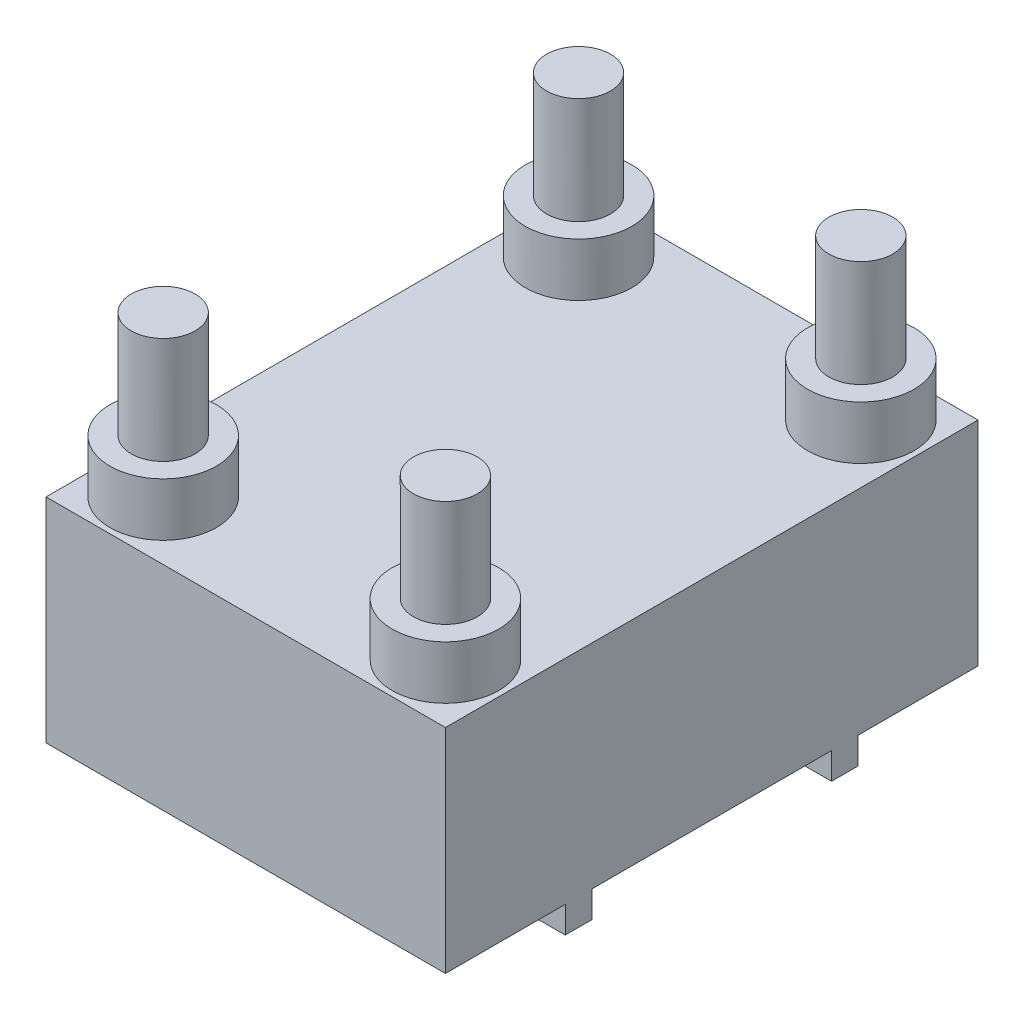
ISO-10303-21;
HEADER;
FILE_DESCRIPTION(('STEP AP214'),'2;1');
FILE_NAME('part.step','',(''),(''),'','','');
FILE_SCHEMA(('AUTOMOTIVE_DESIGN { 1 0 10303 214 1 1 1 1 }'));
ENDSEC;
DATA;
#1=APPLICATION_CONTEXT('core data for automotive mechanical design processes');
#2=APPLICATION_PROTOCOL_DEFINITION('international standard','automotive_design',2000,#1);
#3=PRODUCT_CONTEXT('',#1,'mechanical');
#4=PRODUCT('Part','Part','',(#3));
#5=PRODUCT_RELATED_PRODUCT_CATEGORY('part','',(#4));
#6=PRODUCT_DEFINITION_FORMATION('','',#4);
#7=PRODUCT_DEFINITION_CONTEXT('part definition',#1,'design');
#8=PRODUCT_DEFINITION('design','',#6,#7);
#9=PRODUCT_DEFINITION_SHAPE('','',#8);
#10=(LENGTH_UNIT() NAMED_UNIT(*) SI_UNIT(.MILLI.,.METRE.));
#11=(NAMED_UNIT(*) PLANE_ANGLE_UNIT() SI_UNIT($,.RADIAN.));
#12=(NAMED_UNIT(*) SI_UNIT($,.STERADIAN.) SOLID_ANGLE_UNIT());
#13=UNCERTAINTY_MEASURE_WITH_UNIT(LENGTH_MEASURE(1.E-05),#10,'distance_accuracy_value','');
#14=(GEOMETRIC_REPRESENTATION_CONTEXT(3) GLOBAL_UNCERTAINTY_ASSIGNED_CONTEXT((#13)) GLOBAL_UNIT_ASSIGNED_CONTEXT((#10,
#11,#12)) REPRESENTATION_CONTEXT('',''));
#15=CARTESIAN_POINT('',(0.,0.,0.));
#16=DIRECTION('',(0.,0.,1.));
#17=DIRECTION('',(1.,0.,0.));
#18=AXIS2_PLACEMENT_3D('',#15,#16,#17);
#19=CARTESIAN_POINT('',(0.,0.,0.));
#20=DIRECTION('',(0.,-1.,0.));
#21=DIRECTION('',(0.,0.,-1.));
#22=AXIS2_PLACEMENT_3D('',#19,#20,#21);
#23=PLANE('',#22);
#24=DIRECTION('',(0.,0.,1.));
#25=VECTOR('',#24,1.);
#26=CARTESIAN_POINT('',(-37.5,0.,-50.));
#27=LINE('',#26,#25);
#28=CARTESIAN_POINT('',(-37.5,0.,-22.5));
#29=VERTEX_POINT('',#28);
#30=CARTESIAN_POINT('',(-37.5,0.,22.5));
#31=VERTEX_POINT('',#30);
#32=EDGE_CURVE('E144',#29,#31,#27,.T.);
#33=ORIENTED_EDGE('',*,*,#32,.F.);
#34=DIRECTION('',(-1.,0.,0.));
#35=VECTOR('',#34,1.);
#36=CARTESIAN_POINT('',(37.5,0.,-22.5));
#37=LINE('',#36,#35);
#38=CARTESIAN_POINT('',(37.5,0.,-22.5));
#39=VERTEX_POINT('',#38);
#40=EDGE_CURVE('E133',#39,#29,#37,.T.);
#41=ORIENTED_EDGE('',*,*,#40,.F.);
#42=DIRECTION('',(0.,0.,-1.));
#43=VECTOR('',#42,1.);
#44=CARTESIAN_POINT('',(37.5,0.,-50.));
#45=LINE('',#44,#43);
#46=CARTESIAN_POINT('',(37.5,0.,22.5));
#47=VERTEX_POINT('',#46);
#48=EDGE_CURVE('E63',#47,#39,#45,.T.);
#49=ORIENTED_EDGE('',*,*,#48,.F.);
#50=DIRECTION('',(-1.,0.,0.));
#51=VECTOR('',#50,1.);
#52=CARTESIAN_POINT('',(37.5,0.,22.5));
#53=LINE('',#52,#51);
#54=EDGE_CURVE('E267',#47,#31,#53,.T.);
#55=ORIENTED_EDGE('',*,*,#54,.T.);
#56=EDGE_LOOP('',(#33,#41,#49,#55));
#57=FACE_BOUND('',#56,.T.);
#58=ADVANCED_FACE('F39',(#57),#23,.T.);
#59=DIRECTION('',(-1.,0.,0.));
#60=VECTOR('',#59,1.);
#61=CARTESIAN_POINT('',(37.5,0.,-27.5));
#62=LINE('',#61,#60);
#63=CARTESIAN_POINT('',(37.5,0.,-27.5));
#64=VERTEX_POINT('',#63);
#65=CARTESIAN_POINT('',(-37.5,0.,-27.5));
#66=VERTEX_POINT('',#65);
#67=EDGE_CURVE('E55',#64,#66,#62,.T.);
#68=ORIENTED_EDGE('',*,*,#67,.T.);
#69=CARTESIAN_POINT('',(-37.5,0.,-50.));
#70=VERTEX_POINT('',#69);
#71=EDGE_CURVE('E233',#70,#66,#27,.T.);
#72=ORIENTED_EDGE('',*,*,#71,.F.);
#73=DIRECTION('',(-1.,0.,0.));
#74=VECTOR('',#73,1.);
#75=CARTESIAN_POINT('',(37.5,0.,-50.));
#76=LINE('',#75,#74);
#77=CARTESIAN_POINT('',(37.5,0.,-50.));
#78=VERTEX_POINT('',#77);
#79=EDGE_CURVE('E159',#78,#70,#76,.T.);
#80=ORIENTED_EDGE('',*,*,#79,.F.);
#81=EDGE_CURVE('E155',#64,#78,#45,.T.);
#82=ORIENTED_EDGE('',*,*,#81,.F.);
#83=EDGE_LOOP('',(#68,#72,#80,#82));
#84=FACE_BOUND('',#83,.T.);
#85=ADVANCED_FACE('F310',(#84),#23,.T.);
#86=CARTESIAN_POINT('',(-37.5,40.,-50.));
#87=DIRECTION('',(1.,0.,0.));
#88=DIRECTION('',(0.,0.,-1.));
#89=AXIS2_PLACEMENT_3D('',#86,#87,#88);
#90=PLANE('',#89);
#91=ORIENTED_EDGE('',*,*,#71,.T.);
#92=DIRECTION('',(0.,1.,0.));
#93=VECTOR('',#92,1.);
#94=CARTESIAN_POINT('',(-37.5,-5.,-27.5));
#95=LINE('',#94,#93);
#96=CARTESIAN_POINT('',(-37.5,-5.,-27.5));
#97=VERTEX_POINT('',#96);
#98=EDGE_CURVE('E281',#97,#66,#95,.T.);
#99=ORIENTED_EDGE('',*,*,#98,.F.);
#100=DIRECTION('',(0.,0.,-1.));
#101=VECTOR('',#100,1.);
#102=CARTESIAN_POINT('',(-37.5,-5.,-22.5));
#103=LINE('',#102,#101);
#104=CARTESIAN_POINT('',(-37.5,-5.,-22.5));
#105=VERTEX_POINT('',#104);
#106=EDGE_CURVE('E284',#105,#97,#103,.T.);
#107=ORIENTED_EDGE('',*,*,#106,.F.);
#108=DIRECTION('',(0.,1.,0.));
#109=VECTOR('',#108,1.);
#110=CARTESIAN_POINT('',(-37.5,-5.,-22.5));
#111=LINE('',#110,#109);
#112=EDGE_CURVE('E140',#105,#29,#111,.T.);
#113=ORIENTED_EDGE('',*,*,#112,.T.);
#114=ORIENTED_EDGE('',*,*,#32,.T.);
#115=DIRECTION('',(0.,1.,0.));
#116=VECTOR('',#115,1.);
#117=CARTESIAN_POINT('',(-37.5,-5.,22.5));
#118=LINE('',#117,#116);
#119=CARTESIAN_POINT('',(-37.5,-5.,22.5));
#120=VERTEX_POINT('',#119);
#121=EDGE_CURVE('E252',#120,#31,#118,.T.);
#122=ORIENTED_EDGE('',*,*,#121,.F.);
#123=DIRECTION('',(0.,0.,-1.));
#124=VECTOR('',#123,1.);
#125=CARTESIAN_POINT('',(-37.5,-5.,27.5));
#126=LINE('',#125,#124);
#127=CARTESIAN_POINT('',(-37.5,-5.,27.5));
#128=VERTEX_POINT('',#127);
#129=EDGE_CURVE('E264',#128,#120,#126,.T.);
#130=ORIENTED_EDGE('',*,*,#129,.F.);
#131=DIRECTION('',(0.,1.,0.));
#132=VECTOR('',#131,1.);
#133=CARTESIAN_POINT('',(-37.5,-5.,27.5));
#134=LINE('',#133,#132);
#135=CARTESIAN_POINT('',(-37.5,0.,27.5));
#136=VERTEX_POINT('',#135);
#137=EDGE_CURVE('E245',#128,#136,#134,.T.);
#138=ORIENTED_EDGE('',*,*,#137,.T.);
#139=CARTESIAN_POINT('',(-37.5,0.,50.));
#140=VERTEX_POINT('',#139);
#141=EDGE_CURVE('E220',#136,#140,#27,.T.);
#142=ORIENTED_EDGE('',*,*,#141,.T.);
#143=DIRECTION('',(0.,-1.,0.));
#144=VECTOR('',#143,1.);
#145=CARTESIAN_POINT('',(-37.5,40.,50.));
#146=LINE('',#145,#144);
#147=CARTESIAN_POINT('',(-37.5,40.,50.));
#148=VERTEX_POINT('',#147);
#149=EDGE_CURVE('E180',#148,#140,#146,.T.);
#150=ORIENTED_EDGE('',*,*,#149,.F.);
#151=DIRECTION('',(0.,0.,1.));
#152=VECTOR('',#151,1.);
#153=CARTESIAN_POINT('',(-37.5,40.,-50.));
#154=LINE('',#153,#152);
#155=CARTESIAN_POINT('',(-37.5,40.,-50.));
#156=VERTEX_POINT('',#155);
#157=EDGE_CURVE('E166',#156,#148,#154,.T.);
#158=ORIENTED_EDGE('',*,*,#157,.F.);
#159=DIRECTION('',(0.,-1.,0.));
#160=VECTOR('',#159,1.);
#161=CARTESIAN_POINT('',(-37.5,40.,-50.));
#162=LINE('',#161,#160);
#163=EDGE_CURVE('E167',#156,#70,#162,.T.);
#164=ORIENTED_EDGE('',*,*,#163,.T.);
#165=EDGE_LOOP('',(#91,#99,#107,#113,#114,#122,#130,#138,#142,#150,#158,#164));
#166=FACE_BOUND('',#165,.T.);
#167=ADVANCED_FACE('F41',(#166),#90,.F.);
#168=CARTESIAN_POINT('',(37.5,40.,50.));
#169=DIRECTION('',(0.,0.,-1.));
#170=DIRECTION('',(-1.,0.,0.));
#171=AXIS2_PLACEMENT_3D('',#168,#169,#170);
#172=PLANE('',#171);
#173=DIRECTION('',(1.,0.,0.));
#174=VECTOR('',#173,1.);
#175=CARTESIAN_POINT('',(37.5,0.,50.));
#176=LINE('',#175,#174);
#177=CARTESIAN_POINT('',(37.5,0.,50.));
#178=VERTEX_POINT('',#177);
#179=EDGE_CURVE('E160',#140,#178,#176,.T.);
#180=ORIENTED_EDGE('',*,*,#179,.T.);
#181=DIRECTION('',(0.,-1.,0.));
#182=VECTOR('',#181,1.);
#183=CARTESIAN_POINT('',(37.5,40.,50.));
#184=LINE('',#183,#182);
#185=CARTESIAN_POINT('',(37.5,40.,50.));
#186=VERTEX_POINT('',#185);
#187=EDGE_CURVE('E176',#186,#178,#184,.T.);
#188=ORIENTED_EDGE('',*,*,#187,.F.);
#189=DIRECTION('',(1.,0.,0.));
#190=VECTOR('',#189,1.);
#191=CARTESIAN_POINT('',(37.5,40.,50.));
#192=LINE('',#191,#190);
#193=EDGE_CURVE('E211',#148,#186,#192,.T.);
#194=ORIENTED_EDGE('',*,*,#193,.F.);
#195=ORIENTED_EDGE('',*,*,#149,.T.);
#196=EDGE_LOOP('',(#180,#188,#194,#195));
#197=FACE_BOUND('',#196,.T.);
#198=ADVANCED_FACE('F223',(#197),#172,.F.);
#199=CARTESIAN_POINT('',(37.5,40.,-50.));
#200=DIRECTION('',(-1.,0.,0.));
#201=DIRECTION('',(0.,0.,1.));
#202=AXIS2_PLACEMENT_3D('',#199,#200,#201);
#203=PLANE('',#202);
#204=CARTESIAN_POINT('',(37.5,0.,27.5));
#205=VERTEX_POINT('',#204);
#206=EDGE_CURVE('E154',#178,#205,#45,.T.);
#207=ORIENTED_EDGE('',*,*,#206,.T.);
#208=DIRECTION('',(0.,1.,0.));
#209=VECTOR('',#208,1.);
#210=CARTESIAN_POINT('',(37.5,-5.,27.5));
#211=LINE('',#210,#209);
#212=CARTESIAN_POINT('',(37.5,-5.,27.5));
#213=VERTEX_POINT('',#212);
#214=EDGE_CURVE('E241',#213,#205,#211,.T.);
#215=ORIENTED_EDGE('',*,*,#214,.F.);
#216=DIRECTION('',(0.,0.,-1.));
#217=VECTOR('',#216,1.);
#218=CARTESIAN_POINT('',(37.5,-5.,27.5));
#219=LINE('',#218,#217);
#220=CARTESIAN_POINT('',(37.5,-5.,22.5));
#221=VERTEX_POINT('',#220);
#222=EDGE_CURVE('E255',#213,#221,#219,.T.);
#223=ORIENTED_EDGE('',*,*,#222,.T.);
#224=DIRECTION('',(0.,1.,0.));
#225=VECTOR('',#224,1.);
#226=CARTESIAN_POINT('',(37.5,-5.,22.5));
#227=LINE('',#226,#225);
#228=EDGE_CURVE('E151',#221,#47,#227,.T.);
#229=ORIENTED_EDGE('',*,*,#228,.T.);
#230=ORIENTED_EDGE('',*,*,#48,.T.);
#231=DIRECTION('',(0.,1.,0.));
#232=VECTOR('',#231,1.);
#233=CARTESIAN_POINT('',(37.5,-5.,-22.5));
#234=LINE('',#233,#232);
#235=CARTESIAN_POINT('',(37.5,-5.,-22.5));
#236=VERTEX_POINT('',#235);
#237=EDGE_CURVE('E130',#236,#39,#234,.T.);
#238=ORIENTED_EDGE('',*,*,#237,.F.);
#239=DIRECTION('',(0.,0.,-1.));
#240=VECTOR('',#239,1.);
#241=CARTESIAN_POINT('',(37.5,-5.,-22.5));
#242=LINE('',#241,#240);
#243=CARTESIAN_POINT('',(37.5,-5.,-27.5));
#244=VERTEX_POINT('',#243);
#245=EDGE_CURVE('E278',#236,#244,#242,.T.);
#246=ORIENTED_EDGE('',*,*,#245,.T.);
#247=DIRECTION('',(0.,1.,0.));
#248=VECTOR('',#247,1.);
#249=CARTESIAN_POINT('',(37.5,-5.,-27.5));
#250=LINE('',#249,#248);
#251=EDGE_CURVE('E141',#244,#64,#250,.T.);
#252=ORIENTED_EDGE('',*,*,#251,.T.);
#253=ORIENTED_EDGE('',*,*,#81,.T.);
#254=DIRECTION('',(0.,-1.,0.));
#255=VECTOR('',#254,1.);
#256=CARTESIAN_POINT('',(37.5,40.,-50.));
#257=LINE('',#256,#255);
#258=CARTESIAN_POINT('',(37.5,40.,-50.));
#259=VERTEX_POINT('',#258);
#260=EDGE_CURVE('E171',#259,#78,#257,.T.);
#261=ORIENTED_EDGE('',*,*,#260,.F.);
#262=DIRECTION('',(0.,0.,-1.));
#263=VECTOR('',#262,1.);
#264=CARTESIAN_POINT('',(37.5,40.,-50.));
#265=LINE('',#264,#263);
#266=EDGE_CURVE('E226',#186,#259,#265,.T.);
#267=ORIENTED_EDGE('',*,*,#266,.F.);
#268=ORIENTED_EDGE('',*,*,#187,.T.);
#269=EDGE_LOOP('',(#207,#215,#223,#229,#230,#238,#246,#252,#253,#261,#267,#268));
#270=FACE_BOUND('',#269,.T.);
#271=ADVANCED_FACE('F149',(#270),#203,.F.);
#272=CARTESIAN_POINT('',(37.5,40.,-50.));
#273=DIRECTION('',(0.,0.,1.));
#274=DIRECTION('',(1.,0.,0.));
#275=AXIS2_PLACEMENT_3D('',#272,#273,#274);
#276=PLANE('',#275);
#277=ORIENTED_EDGE('',*,*,#79,.T.);
#278=ORIENTED_EDGE('',*,*,#163,.F.);
#279=DIRECTION('',(-1.,0.,0.));
#280=VECTOR('',#279,1.);
#281=CARTESIAN_POINT('',(37.5,40.,-50.));
#282=LINE('',#281,#280);
#283=EDGE_CURVE('E172',#259,#156,#282,.T.);
#284=ORIENTED_EDGE('',*,*,#283,.F.);
#285=ORIENTED_EDGE('',*,*,#260,.T.);
#286=EDGE_LOOP('',(#277,#278,#284,#285));
#287=FACE_BOUND('',#286,.T.);
#288=ADVANCED_FACE('F201',(#287),#276,.F.);
#289=CARTESIAN_POINT('',(0.,40.,0.));
#290=DIRECTION('',(0.,-1.,0.));
#291=DIRECTION('',(0.,0.,-1.));
#292=AXIS2_PLACEMENT_3D('',#289,#290,#291);
#293=PLANE('',#292);
#294=CARTESIAN_POINT('',(-26.5,40.,39.));
#295=DIRECTION('',(0.,-1.,0.));
#296=DIRECTION('',(0.,0.,-1.));
#297=AXIS2_PLACEMENT_3D('',#294,#295,#296);
#298=CIRCLE('',#297,10.);
#299=CARTESIAN_POINT('',(-26.5,40.,29.));
#300=VERTEX_POINT('',#299);
#301=EDGE_CURVE('E11',#300,#300,#298,.F.);
#302=ORIENTED_EDGE('',*,*,#301,.F.);
#303=EDGE_LOOP('',(#302));
#304=FACE_BOUND('',#303,.T.);
#305=CARTESIAN_POINT('',(26.5,40.,39.));
#306=DIRECTION('',(0.,-1.,0.));
#307=DIRECTION('',(0.,0.,-1.));
#308=AXIS2_PLACEMENT_3D('',#305,#306,#307);
#309=CIRCLE('',#308,10.);
#310=CARTESIAN_POINT('',(26.5,40.,29.));
#311=VERTEX_POINT('',#310);
#312=EDGE_CURVE('E48',#311,#311,#309,.F.);
#313=ORIENTED_EDGE('',*,*,#312,.F.);
#314=EDGE_LOOP('',(#313));
#315=FACE_BOUND('',#314,.T.);
#316=CARTESIAN_POINT('',(26.5,40.,-39.));
#317=DIRECTION('',(0.,-1.,0.));
#318=DIRECTION('',(0.,0.,-1.));
#319=AXIS2_PLACEMENT_3D('',#316,#317,#318);
#320=CIRCLE('',#319,10.);
#321=CARTESIAN_POINT('',(26.5,40.,-49.));
#322=VERTEX_POINT('',#321);
#323=EDGE_CURVE('E188',#322,#322,#320,.F.);
#324=ORIENTED_EDGE('',*,*,#323,.F.);
#325=EDGE_LOOP('',(#324));
#326=FACE_BOUND('',#325,.T.);
#327=CARTESIAN_POINT('',(-26.5,40.,-39.));
#328=DIRECTION('',(0.,-1.,0.));
#329=DIRECTION('',(0.,0.,-1.));
#330=AXIS2_PLACEMENT_3D('',#327,#328,#329);
#331=CIRCLE('',#330,10.);
#332=CARTESIAN_POINT('',(-26.5,40.,-49.));
#333=VERTEX_POINT('',#332);
#334=EDGE_CURVE('E184',#333,#333,#331,.F.);
#335=ORIENTED_EDGE('',*,*,#334,.F.);
#336=EDGE_LOOP('',(#335));
#337=FACE_BOUND('',#336,.T.);
#338=ORIENTED_EDGE('',*,*,#157,.T.);
#339=ORIENTED_EDGE('',*,*,#193,.T.);
#340=ORIENTED_EDGE('',*,*,#266,.T.);
#341=ORIENTED_EDGE('',*,*,#283,.T.);
#342=EDGE_LOOP('',(#338,#339,#340,#341));
#343=FACE_BOUND('',#342,.T.);
#344=ADVANCED_FACE('F197',(#304,#315,#326,#337,#343),#293,.F.);
#345=DIRECTION('',(-1.,0.,0.));
#346=VECTOR('',#345,1.);
#347=CARTESIAN_POINT('',(37.5,0.,27.5));
#348=LINE('',#347,#346);
#349=EDGE_CURVE('E248',#205,#136,#348,.T.);
#350=ORIENTED_EDGE('',*,*,#349,.F.);
#351=ORIENTED_EDGE('',*,*,#206,.F.);
#352=ORIENTED_EDGE('',*,*,#179,.F.);
#353=ORIENTED_EDGE('',*,*,#141,.F.);
#354=EDGE_LOOP('',(#350,#351,#352,#353));
#355=FACE_BOUND('',#354,.T.);
#356=ADVANCED_FACE('F200',(#355),#23,.T.);
#357=CARTESIAN_POINT('',(37.5,-5.,22.5));
#358=DIRECTION('',(0.,0.,-1.));
#359=DIRECTION('',(-1.,0.,0.));
#360=AXIS2_PLACEMENT_3D('',#357,#358,#359);
#361=PLANE('',#360);
#362=ORIENTED_EDGE('',*,*,#54,.F.);
#363=ORIENTED_EDGE('',*,*,#228,.F.);
#364=DIRECTION('',(-1.,0.,0.));
#365=VECTOR('',#364,1.);
#366=CARTESIAN_POINT('',(37.5,-5.,22.5));
#367=LINE('',#366,#365);
#368=EDGE_CURVE('E272',#221,#120,#367,.T.);
#369=ORIENTED_EDGE('',*,*,#368,.T.);
#370=ORIENTED_EDGE('',*,*,#121,.T.);
#371=EDGE_LOOP('',(#362,#363,#369,#370));
#372=FACE_BOUND('',#371,.T.);
#373=ADVANCED_FACE('F298',(#372),#361,.T.);
#374=CARTESIAN_POINT('',(37.5,-5.,27.5));
#375=DIRECTION('',(0.,0.,-1.));
#376=DIRECTION('',(-1.,0.,0.));
#377=AXIS2_PLACEMENT_3D('',#374,#375,#376);
#378=PLANE('',#377);
#379=ORIENTED_EDGE('',*,*,#349,.T.);
#380=ORIENTED_EDGE('',*,*,#137,.F.);
#381=DIRECTION('',(-1.,0.,0.));
#382=VECTOR('',#381,1.);
#383=CARTESIAN_POINT('',(37.5,-5.,27.5));
#384=LINE('',#383,#382);
#385=EDGE_CURVE('E260',#213,#128,#384,.T.);
#386=ORIENTED_EDGE('',*,*,#385,.F.);
#387=ORIENTED_EDGE('',*,*,#214,.T.);
#388=EDGE_LOOP('',(#379,#380,#386,#387));
#389=FACE_BOUND('',#388,.T.);
#390=ADVANCED_FACE('F300',(#389),#378,.F.);
#391=CARTESIAN_POINT('',(0.,-5.,0.));
#392=DIRECTION('',(0.,-1.,0.));
#393=DIRECTION('',(0.,0.,-1.));
#394=AXIS2_PLACEMENT_3D('',#391,#392,#393);
#395=PLANE('',#394);
#396=ORIENTED_EDGE('',*,*,#368,.F.);
#397=ORIENTED_EDGE('',*,*,#222,.F.);
#398=ORIENTED_EDGE('',*,*,#385,.T.);
#399=ORIENTED_EDGE('',*,*,#129,.T.);
#400=EDGE_LOOP('',(#396,#397,#398,#399));
#401=FACE_BOUND('',#400,.T.);
#402=ADVANCED_FACE('F295',(#401),#395,.T.);
#403=CARTESIAN_POINT('',(37.5,-5.,-27.5));
#404=DIRECTION('',(0.,0.,-1.));
#405=DIRECTION('',(-1.,0.,0.));
#406=AXIS2_PLACEMENT_3D('',#403,#404,#405);
#407=PLANE('',#406);
#408=ORIENTED_EDGE('',*,*,#67,.F.);
#409=ORIENTED_EDGE('',*,*,#251,.F.);
#410=DIRECTION('',(-1.,0.,0.));
#411=VECTOR('',#410,1.);
#412=CARTESIAN_POINT('',(37.5,-5.,-27.5));
#413=LINE('',#412,#411);
#414=EDGE_CURVE('E146',#244,#97,#413,.T.);
#415=ORIENTED_EDGE('',*,*,#414,.T.);
#416=ORIENTED_EDGE('',*,*,#98,.T.);
#417=EDGE_LOOP('',(#408,#409,#415,#416));
#418=FACE_BOUND('',#417,.T.);
#419=ADVANCED_FACE('F385',(#418),#407,.T.);
#420=CARTESIAN_POINT('',(37.5,-5.,-22.5));
#421=DIRECTION('',(0.,0.,-1.));
#422=DIRECTION('',(-1.,0.,0.));
#423=AXIS2_PLACEMENT_3D('',#420,#421,#422);
#424=PLANE('',#423);
#425=ORIENTED_EDGE('',*,*,#40,.T.);
#426=ORIENTED_EDGE('',*,*,#112,.F.);
#427=DIRECTION('',(-1.,0.,0.));
#428=VECTOR('',#427,1.);
#429=CARTESIAN_POINT('',(37.5,-5.,-22.5));
#430=LINE('',#429,#428);
#431=EDGE_CURVE('E135',#236,#105,#430,.T.);
#432=ORIENTED_EDGE('',*,*,#431,.F.);
#433=ORIENTED_EDGE('',*,*,#237,.T.);
#434=EDGE_LOOP('',(#425,#426,#432,#433));
#435=FACE_BOUND('',#434,.T.);
#436=ADVANCED_FACE('F131',(#435),#424,.F.);
#437=CARTESIAN_POINT('',(0.,-5.,0.));
#438=DIRECTION('',(0.,-1.,0.));
#439=DIRECTION('',(0.,0.,-1.));
#440=AXIS2_PLACEMENT_3D('',#437,#438,#439);
#441=PLANE('',#440);
#442=ORIENTED_EDGE('',*,*,#414,.F.);
#443=ORIENTED_EDGE('',*,*,#245,.F.);
#444=ORIENTED_EDGE('',*,*,#431,.T.);
#445=ORIENTED_EDGE('',*,*,#106,.T.);
#446=EDGE_LOOP('',(#442,#443,#444,#445));
#447=FACE_BOUND('',#446,.T.);
#448=ADVANCED_FACE('F400',(#447),#441,.T.);
#449=CARTESIAN_POINT('',(-26.5,50.,-39.));
#450=DIRECTION('',(0.,1.,0.));
#451=DIRECTION('',(0.,0.,1.));
#452=AXIS2_PLACEMENT_3D('',#449,#450,#451);
#453=PLANE('',#452);
#454=CARTESIAN_POINT('',(-26.5,50.,-39.));
#455=DIRECTION('',(0.,1.,0.));
#456=DIRECTION('',(0.,0.,1.));
#457=AXIS2_PLACEMENT_3D('',#454,#455,#456);
#458=CIRCLE('',#457,10.);
#459=CARTESIAN_POINT('',(-26.5,50.,-29.));
#460=VERTEX_POINT('',#459);
#461=EDGE_CURVE('E621',#460,#460,#458,.T.);
#462=ORIENTED_EDGE('',*,*,#461,.T.);
#463=EDGE_LOOP('',(#462));
#464=FACE_BOUND('',#463,.T.);
#465=CARTESIAN_POINT('',(-26.5,50.,-39.));
#466=DIRECTION('',(0.,1.,0.));
#467=DIRECTION('',(0.,0.,1.));
#468=AXIS2_PLACEMENT_3D('',#465,#466,#467);
#469=CIRCLE('',#468,6.);
#470=CARTESIAN_POINT('',(-26.5,50.,-33.));
#471=VERTEX_POINT('',#470);
#472=EDGE_CURVE('E617',#471,#471,#469,.T.);
#473=ORIENTED_EDGE('',*,*,#472,.F.);
#474=EDGE_LOOP('',(#473));
#475=FACE_BOUND('',#474,.T.);
#476=ADVANCED_FACE('F408',(#464,#475),#453,.T.);
#477=CARTESIAN_POINT('',(-26.5,50.,-39.));
#478=DIRECTION('',(0.,-1.,0.));
#479=DIRECTION('',(0.,0.,-1.));
#480=AXIS2_PLACEMENT_3D('',#477,#478,#479);
#481=CYLINDRICAL_SURFACE('',#480,10.);
#482=ORIENTED_EDGE('',*,*,#461,.F.);
#483=EDGE_LOOP('',(#482));
#484=FACE_BOUND('',#483,.T.);
#485=ORIENTED_EDGE('',*,*,#334,.T.);
#486=EDGE_LOOP('',(#485));
#487=FACE_BOUND('',#486,.T.);
#488=ADVANCED_FACE('F418',(#484,#487),#481,.T.);
#489=CARTESIAN_POINT('',(26.5,50.,-39.));
#490=DIRECTION('',(0.,-1.,0.));
#491=DIRECTION('',(0.,0.,-1.));
#492=AXIS2_PLACEMENT_3D('',#489,#490,#491);
#493=PLANE('',#492);
#494=CARTESIAN_POINT('',(26.5,50.,-39.));
#495=DIRECTION('',(0.,1.,0.));
#496=DIRECTION('',(0.,0.,-1.));
#497=AXIS2_PLACEMENT_3D('',#494,#495,#496);
#498=CIRCLE('',#497,10.);
#499=CARTESIAN_POINT('',(26.5,50.,-49.));
#500=VERTEX_POINT('',#499);
#501=EDGE_CURVE('E613',#500,#500,#498,.T.);
#502=ORIENTED_EDGE('',*,*,#501,.T.);
#503=EDGE_LOOP('',(#502));
#504=FACE_BOUND('',#503,.T.);
#505=CARTESIAN_POINT('',(26.5,50.,-39.));
#506=DIRECTION('',(0.,1.,0.));
#507=DIRECTION('',(0.,0.,-1.));
#508=AXIS2_PLACEMENT_3D('',#505,#506,#507);
#509=CIRCLE('',#508,6.);
#510=CARTESIAN_POINT('',(26.5,50.,-45.));
#511=VERTEX_POINT('',#510);
#512=EDGE_CURVE('E609',#511,#511,#509,.T.);
#513=ORIENTED_EDGE('',*,*,#512,.F.);
#514=EDGE_LOOP('',(#513));
#515=FACE_BOUND('',#514,.T.);
#516=ADVANCED_FACE('F427',(#504,#515),#493,.F.);
#517=CARTESIAN_POINT('',(26.5,50.,-39.));
#518=DIRECTION('',(0.,-1.,0.));
#519=DIRECTION('',(0.,0.,-1.));
#520=AXIS2_PLACEMENT_3D('',#517,#518,#519);
#521=CYLINDRICAL_SURFACE('',#520,10.);
#522=ORIENTED_EDGE('',*,*,#501,.F.);
#523=EDGE_LOOP('',(#522));
#524=FACE_BOUND('',#523,.T.);
#525=ORIENTED_EDGE('',*,*,#323,.T.);
#526=EDGE_LOOP('',(#525));
#527=FACE_BOUND('',#526,.T.);
#528=ADVANCED_FACE('F436',(#524,#527),#521,.T.);
#529=CARTESIAN_POINT('',(26.5,50.,39.));
#530=DIRECTION('',(0.,1.,0.));
#531=DIRECTION('',(0.,0.,1.));
#532=AXIS2_PLACEMENT_3D('',#529,#530,#531);
#533=PLANE('',#532);
#534=CARTESIAN_POINT('',(26.5,50.,39.));
#535=DIRECTION('',(0.,1.,0.));
#536=DIRECTION('',(0.,0.,1.));
#537=AXIS2_PLACEMENT_3D('',#534,#535,#536);
#538=CIRCLE('',#537,10.);
#539=CARTESIAN_POINT('',(26.5,50.,49.));
#540=VERTEX_POINT('',#539);
#541=EDGE_CURVE('E605',#540,#540,#538,.T.);
#542=ORIENTED_EDGE('',*,*,#541,.T.);
#543=EDGE_LOOP('',(#542));
#544=FACE_BOUND('',#543,.T.);
#545=CARTESIAN_POINT('',(26.5,50.,39.));
#546=DIRECTION('',(0.,1.,0.));
#547=DIRECTION('',(0.,0.,1.));
#548=AXIS2_PLACEMENT_3D('',#545,#546,#547);
#549=CIRCLE('',#548,6.);
#550=CARTESIAN_POINT('',(26.5,50.,45.));
#551=VERTEX_POINT('',#550);
#552=EDGE_CURVE('E601',#551,#551,#549,.T.);
#553=ORIENTED_EDGE('',*,*,#552,.F.);
#554=EDGE_LOOP('',(#553));
#555=FACE_BOUND('',#554,.T.);
#556=ADVANCED_FACE('F445',(#544,#555),#533,.T.);
#557=CARTESIAN_POINT('',(26.5,50.,39.));
#558=DIRECTION('',(0.,-1.,0.));
#559=DIRECTION('',(0.,0.,-1.));
#560=AXIS2_PLACEMENT_3D('',#557,#558,#559);
#561=CYLINDRICAL_SURFACE('',#560,10.);
#562=ORIENTED_EDGE('',*,*,#541,.F.);
#563=EDGE_LOOP('',(#562));
#564=FACE_BOUND('',#563,.T.);
#565=ORIENTED_EDGE('',*,*,#312,.T.);
#566=EDGE_LOOP('',(#565));
#567=FACE_BOUND('',#566,.T.);
#568=ADVANCED_FACE('F195',(#564,#567),#561,.T.);
#569=CARTESIAN_POINT('',(-26.5,50.,39.));
#570=DIRECTION('',(0.,-1.,0.));
#571=DIRECTION('',(0.,0.,-1.));
#572=AXIS2_PLACEMENT_3D('',#569,#570,#571);
#573=PLANE('',#572);
#574=CARTESIAN_POINT('',(-26.5,50.,39.));
#575=DIRECTION('',(0.,1.,0.));
#576=DIRECTION('',(0.,0.,-1.));
#577=AXIS2_PLACEMENT_3D('',#574,#575,#576);
#578=CIRCLE('',#577,10.);
#579=CARTESIAN_POINT('',(-26.5,50.,29.));
#580=VERTEX_POINT('',#579);
#581=EDGE_CURVE('E597',#580,#580,#578,.T.);
#582=ORIENTED_EDGE('',*,*,#581,.T.);
#583=EDGE_LOOP('',(#582));
#584=FACE_BOUND('',#583,.T.);
#585=CARTESIAN_POINT('',(-26.5,50.,39.));
#586=DIRECTION('',(0.,1.,0.));
#587=DIRECTION('',(0.,0.,-1.));
#588=AXIS2_PLACEMENT_3D('',#585,#586,#587);
#589=CIRCLE('',#588,6.);
#590=CARTESIAN_POINT('',(-26.5,50.,33.));
#591=VERTEX_POINT('',#590);
#592=EDGE_CURVE('E593',#591,#591,#589,.T.);
#593=ORIENTED_EDGE('',*,*,#592,.F.);
#594=EDGE_LOOP('',(#593));
#595=FACE_BOUND('',#594,.T.);
#596=ADVANCED_FACE('F462',(#584,#595),#573,.F.);
#597=CARTESIAN_POINT('',(-26.5,50.,39.));
#598=DIRECTION('',(0.,-1.,0.));
#599=DIRECTION('',(0.,0.,-1.));
#600=AXIS2_PLACEMENT_3D('',#597,#598,#599);
#601=CYLINDRICAL_SURFACE('',#600,10.);
#602=ORIENTED_EDGE('',*,*,#581,.F.);
#603=EDGE_LOOP('',(#602));
#604=FACE_BOUND('',#603,.T.);
#605=ORIENTED_EDGE('',*,*,#301,.T.);
#606=EDGE_LOOP('',(#605));
#607=FACE_BOUND('',#606,.T.);
#608=ADVANCED_FACE('F471',(#604,#607),#601,.T.);
#609=CARTESIAN_POINT('',(-26.5,70.,39.));
#610=DIRECTION('',(0.,-1.,0.));
#611=DIRECTION('',(0.,0.,-1.));
#612=AXIS2_PLACEMENT_3D('',#609,#610,#611);
#613=CYLINDRICAL_SURFACE('',#612,6.);
#614=CARTESIAN_POINT('',(-26.5,70.,39.));
#615=DIRECTION('',(0.,1.,0.));
#616=DIRECTION('',(0.,0.,1.));
#617=AXIS2_PLACEMENT_3D('',#614,#615,#616);
#618=CIRCLE('',#617,6.);
#619=CARTESIAN_POINT('',(-26.5,70.,45.));
#620=VERTEX_POINT('',#619);
#621=EDGE_CURVE('E589',#620,#620,#618,.T.);
#622=ORIENTED_EDGE('',*,*,#621,.F.);
#623=EDGE_LOOP('',(#622));
#624=FACE_BOUND('',#623,.T.);
#625=ORIENTED_EDGE('',*,*,#592,.T.);
#626=EDGE_LOOP('',(#625));
#627=FACE_BOUND('',#626,.T.);
#628=ADVANCED_FACE('F480',(#624,#627),#613,.T.);
#629=CARTESIAN_POINT('',(-26.5,70.,39.));
#630=DIRECTION('',(0.,1.,0.));
#631=DIRECTION('',(0.,0.,1.));
#632=AXIS2_PLACEMENT_3D('',#629,#630,#631);
#633=PLANE('',#632);
#634=ORIENTED_EDGE('',*,*,#621,.T.);
#635=EDGE_LOOP('',(#634));
#636=FACE_BOUND('',#635,.T.);
#637=ADVANCED_FACE('F489',(#636),#633,.T.);
#638=CARTESIAN_POINT('',(-26.5,70.,-39.));
#639=DIRECTION('',(0.,-1.,0.));
#640=DIRECTION('',(0.,0.,-1.));
#641=AXIS2_PLACEMENT_3D('',#638,#639,#640);
#642=CYLINDRICAL_SURFACE('',#641,6.);
#643=ORIENTED_EDGE('',*,*,#472,.T.);
#644=EDGE_LOOP('',(#643));
#645=FACE_BOUND('',#644,.T.);
#646=CARTESIAN_POINT('',(-26.5,70.,-39.));
#647=DIRECTION('',(0.,1.,0.));
#648=DIRECTION('',(0.,0.,-1.));
#649=AXIS2_PLACEMENT_3D('',#646,#647,#648);
#650=CIRCLE('',#649,6.);
#651=CARTESIAN_POINT('',(-26.5,70.,-45.));
#652=VERTEX_POINT('',#651);
#653=EDGE_CURVE('E583',#652,#652,#650,.T.);
#654=ORIENTED_EDGE('',*,*,#653,.F.);
#655=EDGE_LOOP('',(#654));
#656=FACE_BOUND('',#655,.T.);
#657=ADVANCED_FACE('F498',(#645,#656),#642,.T.);
#658=CARTESIAN_POINT('',(-26.5,70.,-39.));
#659=DIRECTION('',(0.,-1.,0.));
#660=DIRECTION('',(0.,0.,-1.));
#661=AXIS2_PLACEMENT_3D('',#658,#659,#660);
#662=PLANE('',#661);
#663=ORIENTED_EDGE('',*,*,#653,.T.);
#664=EDGE_LOOP('',(#663));
#665=FACE_BOUND('',#664,.T.);
#666=ADVANCED_FACE('F507',(#665),#662,.F.);
#667=CARTESIAN_POINT('',(26.5,70.,39.));
#668=DIRECTION('',(0.,-1.,0.));
#669=DIRECTION('',(0.,0.,-1.));
#670=AXIS2_PLACEMENT_3D('',#667,#668,#669);
#671=CYLINDRICAL_SURFACE('',#670,6.);
#672=ORIENTED_EDGE('',*,*,#552,.T.);
#673=EDGE_LOOP('',(#672));
#674=FACE_BOUND('',#673,.T.);
#675=CARTESIAN_POINT('',(26.5,70.,39.));
#676=DIRECTION('',(0.,1.,0.));
#677=DIRECTION('',(0.,0.,-1.));
#678=AXIS2_PLACEMENT_3D('',#675,#676,#677);
#679=CIRCLE('',#678,6.);
#680=CARTESIAN_POINT('',(26.5,70.,33.));
#681=VERTEX_POINT('',#680);
#682=EDGE_CURVE('E579',#681,#681,#679,.T.);
#683=ORIENTED_EDGE('',*,*,#682,.F.);
#684=EDGE_LOOP('',(#683));
#685=FACE_BOUND('',#684,.T.);
#686=ADVANCED_FACE('F516',(#674,#685),#671,.T.);
#687=CARTESIAN_POINT('',(26.5,70.,39.));
#688=DIRECTION('',(0.,-1.,0.));
#689=DIRECTION('',(0.,0.,-1.));
#690=AXIS2_PLACEMENT_3D('',#687,#688,#689);
#691=PLANE('',#690);
#692=ORIENTED_EDGE('',*,*,#682,.T.);
#693=EDGE_LOOP('',(#692));
#694=FACE_BOUND('',#693,.T.);
#695=ADVANCED_FACE('F525',(#694),#691,.F.);
#696=CARTESIAN_POINT('',(26.5,70.,-39.));
#697=DIRECTION('',(0.,-1.,0.));
#698=DIRECTION('',(0.,0.,-1.));
#699=AXIS2_PLACEMENT_3D('',#696,#697,#698);
#700=CYLINDRICAL_SURFACE('',#699,6.);
#701=CARTESIAN_POINT('',(26.5,70.,-39.));
#702=DIRECTION('',(0.,1.,0.));
#703=DIRECTION('',(0.,0.,1.));
#704=AXIS2_PLACEMENT_3D('',#701,#702,#703);
#705=CIRCLE('',#704,6.);
#706=CARTESIAN_POINT('',(26.5,70.,-33.));
#707=VERTEX_POINT('',#706);
#708=EDGE_CURVE('E577',#707,#707,#705,.T.);
#709=ORIENTED_EDGE('',*,*,#708,.F.);
#710=EDGE_LOOP('',(#709));
#711=FACE_BOUND('',#710,.T.);
#712=ORIENTED_EDGE('',*,*,#512,.T.);
#713=EDGE_LOOP('',(#712));
#714=FACE_BOUND('',#713,.T.);
#715=ADVANCED_FACE('F534',(#711,#714),#700,.T.);
#716=CARTESIAN_POINT('',(26.5,70.,-39.));
#717=DIRECTION('',(0.,1.,0.));
#718=DIRECTION('',(0.,0.,1.));
#719=AXIS2_PLACEMENT_3D('',#716,#717,#718);
#720=PLANE('',#719);
#721=ORIENTED_EDGE('',*,*,#708,.T.);
#722=EDGE_LOOP('',(#721));
#723=FACE_BOUND('',#722,.T.);
#724=ADVANCED_FACE('F543',(#723),#720,.T.);
#725=CLOSED_SHELL('',(#58,#85,#167,#198,#271,#288,#344,#356,#373,#390,#402,#419,#436,#448,#476,
#488,#516,#528,#556,#568,#596,#608,#628,#637,#657,#666,#686,#695,#715,#724));
#726=MANIFOLD_SOLID_BREP('B2',#725);
#727=ADVANCED_BREP_SHAPE_REPRESENTATION('',(#18,#726),#14);
#728=SHAPE_DEFINITION_REPRESENTATION(#9,#727);
ENDSEC;
END-ISO-10303-21;
